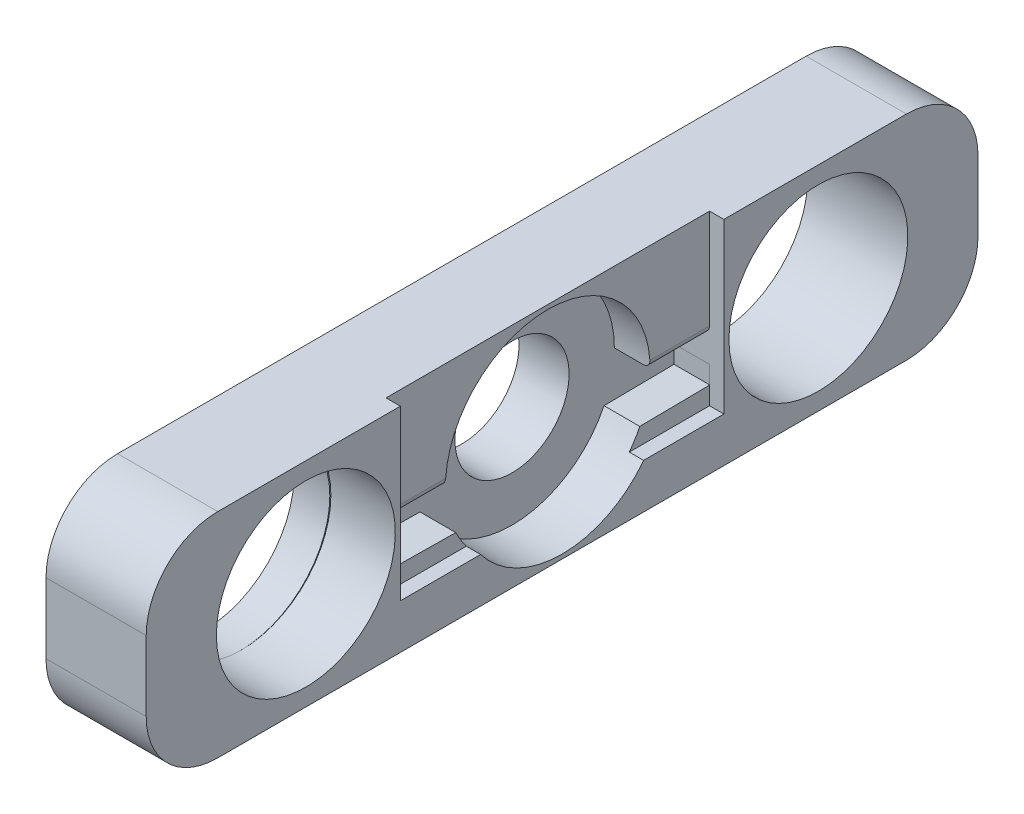
ISO-10303-21;
HEADER;
FILE_DESCRIPTION(('STEP AP214'),'2;1');
FILE_NAME('part.step','',(''),(''),'','','');
FILE_SCHEMA(('AUTOMOTIVE_DESIGN { 1 0 10303 214 1 1 1 1 }'));
ENDSEC;
DATA;
#1=APPLICATION_CONTEXT('core data for automotive mechanical design processes');
#2=APPLICATION_PROTOCOL_DEFINITION('international standard','automotive_design',2000,#1);
#3=PRODUCT_CONTEXT('',#1,'mechanical');
#4=PRODUCT('Part','Part','',(#3));
#5=PRODUCT_RELATED_PRODUCT_CATEGORY('part','',(#4));
#6=PRODUCT_DEFINITION_FORMATION('','',#4);
#7=PRODUCT_DEFINITION_CONTEXT('part definition',#1,'design');
#8=PRODUCT_DEFINITION('design','',#6,#7);
#9=PRODUCT_DEFINITION_SHAPE('','',#8);
#10=(LENGTH_UNIT() NAMED_UNIT(*) SI_UNIT(.MILLI.,.METRE.));
#11=(NAMED_UNIT(*) PLANE_ANGLE_UNIT() SI_UNIT($,.RADIAN.));
#12=(NAMED_UNIT(*) SI_UNIT($,.STERADIAN.) SOLID_ANGLE_UNIT());
#13=UNCERTAINTY_MEASURE_WITH_UNIT(LENGTH_MEASURE(1.E-05),#10,'distance_accuracy_value','');
#14=(GEOMETRIC_REPRESENTATION_CONTEXT(3) GLOBAL_UNCERTAINTY_ASSIGNED_CONTEXT((#13)) GLOBAL_UNIT_ASSIGNED_CONTEXT((#10,
#11,#12)) REPRESENTATION_CONTEXT('',''));
#15=CARTESIAN_POINT('',(0.,0.,0.));
#16=DIRECTION('',(0.,0.,1.));
#17=DIRECTION('',(1.,0.,0.));
#18=AXIS2_PLACEMENT_3D('',#15,#16,#17);
#19=CARTESIAN_POINT('',(-11.,1.,14.3));
#20=DIRECTION('',(0.,0.,-1.));
#21=DIRECTION('',(-1.,0.,0.));
#22=AXIS2_PLACEMENT_3D('',#19,#20,#21);
#23=CYLINDRICAL_SURFACE('',#22,1.);
#24=DIRECTION('',(0.,0.,1.));
#25=VECTOR('',#24,1.);
#26=CARTESIAN_POINT('',(-11.,0.,14.3));
#27=LINE('',#26,#25);
#28=CARTESIAN_POINT('',(-11.,0.,14.3));
#29=VERTEX_POINT('',#28);
#30=CARTESIAN_POINT('',(-11.,0.,22.6));
#31=VERTEX_POINT('',#30);
#32=EDGE_CURVE('E505',#29,#31,#27,.T.);
#33=ORIENTED_EDGE('',*,*,#32,.F.);
#34=CARTESIAN_POINT('',(-10.,1.,14.2649921135625));
#35=CARTESIAN_POINT('',(-10.0000001839213,0.971940749647382,14.2669595760492));
#36=CARTESIAN_POINT('',(-10.0011817400867,0.943888854816139,14.2688422971478));
#37=CARTESIAN_POINT('',(-10.0058983819772,0.887973225385914,14.2724309981915));
#38=CARTESIAN_POINT('',(-10.0094333924086,0.860109484796131,14.2741369837888));
#39=CARTESIAN_POINT('',(-10.0235396717351,0.7771474965545,14.278973910728));
#40=CARTESIAN_POINT('',(-10.037612260885,0.722586611283484,14.2818302315195));
#41=CARTESIAN_POINT('',(-10.0747227897028,0.616564658218299,14.2868007102646));
#42=CARTESIAN_POINT('',(-10.097765728254,0.565105337322298,14.2889144531519));
#43=CARTESIAN_POINT('',(-10.1521684449225,0.466767810094607,14.2924647617664));
#44=CARTESIAN_POINT('',(-10.1835265504415,0.419888685047451,14.2939014635194));
#45=CARTESIAN_POINT('',(-10.2536269156193,0.332108624927635,14.2962104641583));
#46=CARTESIAN_POINT('',(-10.2923596003502,0.29120005820936,14.2970834885217));
#47=CARTESIAN_POINT('',(-10.3761482015788,0.216443239679163,14.2984108818175));
#48=CARTESIAN_POINT('',(-10.4212054139915,0.182596438387455,14.2988651648039));
#49=CARTESIAN_POINT('',(-10.5163888142007,0.122914263973113,14.2995030266934));
#50=CARTESIAN_POINT('',(-10.5665187818761,0.0970849240898362,14.2996864021234));
#51=CARTESIAN_POINT('',(-10.670391751839,0.0542143238037651,14.2999133955513));
#52=CARTESIAN_POINT('',(-10.7241326612563,0.0371680216555287,14.2999570938034));
#53=CARTESIAN_POINT('',(-10.8151609301139,0.0165262477101793,14.2999928119395));
#54=CARTESIAN_POINT('',(-10.8518803391918,0.0103328404690452,14.2999972953188));
#55=CARTESIAN_POINT('',(-10.9257280673413,0.00207012374308491,14.3000000171854));
#56=CARTESIAN_POINT('',(-10.9628557418425,-4.94835473675728E-06,14.2999982644082));
#57=CARTESIAN_POINT('',(-11.,0.,14.3));
#58=B_SPLINE_CURVE_WITH_KNOTS('',3,(#34,#35,#36,#37,#38,#39,#40,#41,#42,#43,#44,#45,#46,#47,#48,
#49,#50,#51,#52,#53,#54,#55,#56,#57),.UNSPECIFIED.,.F.,.F.,(4,2,2,2,2,2,2,2,2,2,2,4),(0.,
0.0843330220050772,0.168663346078217,0.337051221440211,0.50553306851618,0.673981051093867,
0.842211799270698,1.0104770688976,1.17886865496707,1.34716347087021,1.4586621996317,
1.57000480260976),.UNSPECIFIED.);
#59=CARTESIAN_POINT('',(-10.,1.,14.2649921135625));
#60=VERTEX_POINT('',#59);
#61=EDGE_CURVE('E47',#60,#29,#58,.T.);
#62=ORIENTED_EDGE('',*,*,#61,.F.);
#63=DIRECTION('',(0.,0.,1.));
#64=VECTOR('',#63,1.);
#65=CARTESIAN_POINT('',(-10.,1.,14.3));
#66=LINE('',#65,#64);
#67=CARTESIAN_POINT('',(-10.,1.,22.6));
#68=VERTEX_POINT('',#67);
#69=EDGE_CURVE('E504',#68,#60,#66,.F.);
#70=ORIENTED_EDGE('',*,*,#69,.F.);
#71=CARTESIAN_POINT('',(-11.,1.,22.6));
#72=DIRECTION('',(0.,0.,1.));
#73=DIRECTION('',(0.,-1.,0.));
#74=AXIS2_PLACEMENT_3D('',#71,#72,#73);
#75=CIRCLE('',#74,1.);
#76=EDGE_CURVE('E11',#68,#31,#75,.F.);
#77=ORIENTED_EDGE('',*,*,#76,.T.);
#78=EDGE_LOOP('',(#33,#62,#70,#77));
#79=FACE_BOUND('',#78,.T.);
#80=ADVANCED_FACE('F41',(#79),#23,.T.);
#81=CARTESIAN_POINT('',(-11.,1.,-14.3));
#82=DIRECTION('',(0.,0.,1.));
#83=DIRECTION('',(1.,0.,0.));
#84=AXIS2_PLACEMENT_3D('',#81,#82,#83);
#85=CYLINDRICAL_SURFACE('',#84,1.);
#86=DIRECTION('',(0.,0.,1.));
#87=VECTOR('',#86,1.);
#88=CARTESIAN_POINT('',(-11.,0.,-14.3));
#89=LINE('',#88,#87);
#90=CARTESIAN_POINT('',(-11.,0.,-22.6));
#91=VERTEX_POINT('',#90);
#92=CARTESIAN_POINT('',(-11.,0.,-14.3));
#93=VERTEX_POINT('',#92);
#94=EDGE_CURVE('E432',#91,#93,#89,.T.);
#95=ORIENTED_EDGE('',*,*,#94,.F.);
#96=CARTESIAN_POINT('',(-11.,1.,-22.6));
#97=DIRECTION('',(0.,0.,-1.));
#98=DIRECTION('',(-1.,0.,0.));
#99=AXIS2_PLACEMENT_3D('',#96,#97,#98);
#100=CIRCLE('',#99,1.);
#101=CARTESIAN_POINT('',(-10.,1.,-22.6));
#102=VERTEX_POINT('',#101);
#103=EDGE_CURVE('E507',#91,#102,#100,.F.);
#104=ORIENTED_EDGE('',*,*,#103,.T.);
#105=DIRECTION('',(0.,0.,1.));
#106=VECTOR('',#105,1.);
#107=CARTESIAN_POINT('',(-10.,1.,0.));
#108=LINE('',#107,#106);
#109=CARTESIAN_POINT('',(-10.,1.,-14.2649921135625));
#110=VERTEX_POINT('',#109);
#111=EDGE_CURVE('E445',#110,#102,#108,.F.);
#112=ORIENTED_EDGE('',*,*,#111,.F.);
#113=CARTESIAN_POINT('',(-11.,0.,-14.3));
#114=CARTESIAN_POINT('',(-10.9718659509902,1.85908492656748E-07,-14.2999995217285));
#115=CARTESIAN_POINT('',(-10.9437453793993,0.00118803132069571,-14.3000000537811));
#116=CARTESIAN_POINT('',(-10.8877054493952,0.00592682978960824,-14.2999990612576));
#117=CARTESIAN_POINT('',(-10.8597860814195,0.0094776697827219,-14.2999975367799));
#118=CARTESIAN_POINT('',(-10.7766806829,0.0236405886712454,-14.2999837790828));
#119=CARTESIAN_POINT('',(-10.7220512582806,0.037763162510521,-14.2999623874652));
#120=CARTESIAN_POINT('',(-10.6159403542585,0.0749782701949753,-14.2998153977794));
#121=CARTESIAN_POINT('',(-10.5644603879468,0.0980750769548734,-14.2996897500394));
#122=CARTESIAN_POINT('',(-10.4661075809962,0.152581749839348,-14.2992118235167));
#123=CARTESIAN_POINT('',(-10.4192342069557,0.183990651939857,-14.2988595710085));
#124=CARTESIAN_POINT('',(-10.331435971869,0.254223511968777,-14.297783035209));
#125=CARTESIAN_POINT('',(-10.2905102433464,0.293046386638525,-14.2970588062412));
#126=CARTESIAN_POINT('',(-10.2157602627699,0.377001659678559,-14.2950910887215));
#127=CARTESIAN_POINT('',(-10.1819358609677,0.422133924966905,-14.2938476111209));
#128=CARTESIAN_POINT('',(-10.122375258321,0.517375988508842,-14.2907167747901));
#129=CARTESIAN_POINT('',(-10.0966316284675,0.567481158832635,-14.2888300108109));
#130=CARTESIAN_POINT('',(-10.0539093320197,0.671269038674405,-14.284330436707));
#131=CARTESIAN_POINT('',(-10.0369319800324,0.724952283404817,-14.2817175177772));
#132=CARTESIAN_POINT('',(-10.0122232801207,0.834360971890957,-14.275742841679));
#133=CARTESIAN_POINT('',(-10.0044866050497,0.890085219914423,-14.2723815172854));
#134=CARTESIAN_POINT('',(-9.99994394154403,0.973982347737459,-14.2668199685369));
#135=CARTESIAN_POINT('',(-9.99960936293525,1.00202256437248,-14.2648777506571));
#136=CARTESIAN_POINT('',(-10.0012921662766,1.05802161976243,-14.2608337735012));
#137=CARTESIAN_POINT('',(-10.0033096102977,1.08598045635018,-14.2587320100158));
#138=CARTESIAN_POINT('',(-10.0064977822243,1.11381275532523,-14.2565571280753));
#139=B_SPLINE_CURVE_WITH_KNOTS('',3,(#113,#114,#115,#116,#117,#118,#119,#120,#121,#122,#123,
#124,#125,#126,#127,#128,#129,#130,#131,#132,#133,#134,#135,#136,#137,#138),.UNSPECIFIED.,.F.,
.F.,(4,2,2,2,2,2,2,2,2,2,2,2,4),(0.,0.0843503080913396,0.168696580513882,0.337104496051248,
0.505592694350302,0.674061360203864,0.842505429836438,1.01094594706855,1.17923115288472,
1.34754158773194,1.51575494659624,1.59999746708655,1.68424221082298),.UNSPECIFIED.);
#140=EDGE_CURVE('E431',#93,#110,#139,.T.);
#141=ORIENTED_EDGE('',*,*,#140,.F.);
#142=EDGE_LOOP('',(#95,#104,#112,#141));
#143=FACE_BOUND('',#142,.T.);
#144=ADVANCED_FACE('F449',(#143),#85,.T.);
#145=CARTESIAN_POINT('',(-17.,0.,0.));
#146=DIRECTION('',(-1.,0.,0.));
#147=DIRECTION('',(0.,0.,1.));
#148=AXIS2_PLACEMENT_3D('',#145,#146,#147);
#149=PLANE('',#148);
#150=CARTESIAN_POINT('',(-17.,0.,35.8));
#151=DIRECTION('',(1.,0.,0.));
#152=DIRECTION('',(0.,0.,-1.));
#153=AXIS2_PLACEMENT_3D('',#150,#151,#152);
#154=CIRCLE('',#153,12.5);
#155=CARTESIAN_POINT('',(-17.,12.499774997975,35.875));
#156=VERTEX_POINT('',#155);
#157=CARTESIAN_POINT('',(-17.,-12.499774997975,35.875));
#158=VERTEX_POINT('',#157);
#159=EDGE_CURVE('E408',#156,#158,#154,.T.);
#160=ORIENTED_EDGE('',*,*,#159,.T.);
#161=CARTESIAN_POINT('',(-17.,0.,35.95));
#162=DIRECTION('',(-1.,0.,0.));
#163=DIRECTION('',(0.,0.,1.));
#164=AXIS2_PLACEMENT_3D('',#161,#162,#163);
#165=CIRCLE('',#164,12.5);
#166=EDGE_CURVE('E427',#158,#156,#165,.T.);
#167=ORIENTED_EDGE('',*,*,#166,.T.);
#168=EDGE_LOOP('',(#160,#167));
#169=FACE_BOUND('',#168,.T.);
#170=ADVANCED_FACE('F455',(#169),#149,.T.);
#171=CARTESIAN_POINT('',(-10.,0.,0.));
#172=DIRECTION('',(-1.,0.,0.));
#173=DIRECTION('',(0.,0.,1.));
#174=AXIS2_PLACEMENT_3D('',#171,#172,#173);
#175=PLANE('',#174);
#176=DIRECTION('',(0.,-1.,0.));
#177=VECTOR('',#176,1.);
#178=CARTESIAN_POINT('',(-10.,14.9000000000115,22.6));
#179=LINE('',#178,#177);
#180=CARTESIAN_POINT('',(-10.,14.9000000000115,22.6));
#181=VERTEX_POINT('',#180);
#182=EDGE_CURVE('E350',#181,#68,#179,.T.);
#183=ORIENTED_EDGE('',*,*,#182,.T.);
#184=ORIENTED_EDGE('',*,*,#69,.T.);
#185=CARTESIAN_POINT('',(-10.,0.,0.));
#186=DIRECTION('',(-1.,0.,0.));
#187=DIRECTION('',(0.,0.,1.));
#188=AXIS2_PLACEMENT_3D('',#185,#186,#187);
#189=CIRCLE('',#188,14.3);
#190=EDGE_CURVE('E428',#60,#110,#189,.T.);
#191=ORIENTED_EDGE('',*,*,#190,.T.);
#192=ORIENTED_EDGE('',*,*,#111,.T.);
#193=DIRECTION('',(0.,1.,0.));
#194=VECTOR('',#193,1.);
#195=CARTESIAN_POINT('',(-10.,14.9000000000115,-22.6));
#196=LINE('',#195,#194);
#197=CARTESIAN_POINT('',(-10.,14.9000000000115,-22.6));
#198=VERTEX_POINT('',#197);
#199=EDGE_CURVE('E336',#102,#198,#196,.T.);
#200=ORIENTED_EDGE('',*,*,#199,.T.);
#201=DIRECTION('',(0.,0.,1.));
#202=VECTOR('',#201,1.);
#203=CARTESIAN_POINT('',(-10.,14.9000000000115,-22.6));
#204=LINE('',#203,#202);
#205=EDGE_CURVE('E343',#198,#181,#204,.T.);
#206=ORIENTED_EDGE('',*,*,#205,.T.);
#207=EDGE_LOOP('',(#183,#184,#191,#192,#200,#206));
#208=FACE_BOUND('',#207,.T.);
#209=ADVANCED_FACE('F482',(#208),#175,.F.);
#210=CARTESIAN_POINT('',(-15.,0.,0.));
#211=DIRECTION('',(1.,0.,0.));
#212=DIRECTION('',(0.,0.,-1.));
#213=AXIS2_PLACEMENT_3D('',#210,#211,#212);
#214=CYLINDRICAL_SURFACE('',#213,14.3);
#215=CARTESIAN_POINT('',(-15.,0.,0.));
#216=DIRECTION('',(-1.,0.,0.));
#217=DIRECTION('',(0.,0.,1.));
#218=AXIS2_PLACEMENT_3D('',#215,#216,#217);
#219=CIRCLE('',#218,14.3);
#220=CARTESIAN_POINT('',(-15.,-6.26975974502702,-12.8522415453351));
#221=VERTEX_POINT('',#220);
#222=CARTESIAN_POINT('',(-15.,-6.26975974502702,12.8522415453351));
#223=VERTEX_POINT('',#222);
#224=EDGE_CURVE('E405',#221,#223,#219,.T.);
#225=ORIENTED_EDGE('',*,*,#224,.T.);
#226=DIRECTION('',(1.,0.,0.));
#227=VECTOR('',#226,1.);
#228=CARTESIAN_POINT('',(-15.,-6.26975974502702,12.8522415453351));
#229=LINE('',#228,#227);
#230=CARTESIAN_POINT('',(-10.,-6.26975974502702,12.8522415453351));
#231=VERTEX_POINT('',#230);
#232=EDGE_CURVE('E293',#223,#231,#229,.T.);
#233=ORIENTED_EDGE('',*,*,#232,.T.);
#234=CARTESIAN_POINT('',(-10.,-8.64999999998854,11.3871638260015));
#235=VERTEX_POINT('',#234);
#236=EDGE_CURVE('E424',#235,#231,#189,.T.);
#237=ORIENTED_EDGE('',*,*,#236,.F.);
#238=DIRECTION('',(1.,0.,0.));
#239=VECTOR('',#238,1.);
#240=CARTESIAN_POINT('',(-15.,-8.64999999998854,11.3871638260015));
#241=LINE('',#240,#239);
#242=CARTESIAN_POINT('',(-8.00000000000003,-8.64999999998854,11.3871638260016));
#243=VERTEX_POINT('',#242);
#244=EDGE_CURVE('E362',#243,#235,#241,.F.);
#245=ORIENTED_EDGE('',*,*,#244,.F.);
#246=CARTESIAN_POINT('',(-8.00000000000003,0.,0.));
#247=DIRECTION('',(-1.,0.,0.));
#248=DIRECTION('',(0.,0.,1.));
#249=AXIS2_PLACEMENT_3D('',#246,#247,#248);
#250=CIRCLE('',#249,14.3);
#251=CARTESIAN_POINT('',(-8.00000000000003,-8.64999999998854,-11.3871638260015));
#252=VERTEX_POINT('',#251);
#253=EDGE_CURVE('E371',#252,#243,#250,.T.);
#254=ORIENTED_EDGE('',*,*,#253,.F.);
#255=DIRECTION('',(1.,0.,0.));
#256=VECTOR('',#255,1.);
#257=CARTESIAN_POINT('',(-15.,-8.64999999998854,-11.3871638260016));
#258=LINE('',#257,#256);
#259=CARTESIAN_POINT('',(-10.,-8.64999999998854,-11.3871638260016));
#260=VERTEX_POINT('',#259);
#261=EDGE_CURVE('E372',#260,#252,#258,.T.);
#262=ORIENTED_EDGE('',*,*,#261,.F.);
#263=CARTESIAN_POINT('',(-10.,-6.26975974502702,-12.8522415453351));
#264=VERTEX_POINT('',#263);
#265=EDGE_CURVE('E429',#264,#260,#189,.T.);
#266=ORIENTED_EDGE('',*,*,#265,.F.);
#267=DIRECTION('',(1.,0.,0.));
#268=VECTOR('',#267,1.);
#269=CARTESIAN_POINT('',(-15.,-6.26975974502702,-12.8522415453351));
#270=LINE('',#269,#268);
#271=EDGE_CURVE('E320',#221,#264,#270,.T.);
#272=ORIENTED_EDGE('',*,*,#271,.F.);
#273=EDGE_LOOP('',(#225,#233,#237,#245,#254,#262,#266,#272));
#274=FACE_BOUND('',#273,.T.);
#275=ADVANCED_FACE('F561',(#274),#214,.F.);
#276=ORIENTED_EDGE('',*,*,#236,.T.);
#277=DIRECTION('',(0.,0.0122849481946987,0.999924537176608));
#278=VECTOR('',#277,1.);
#279=CARTESIAN_POINT('',(-10.,-6.26975974502702,12.8522415453351));
#280=LINE('',#279,#278);
#281=CARTESIAN_POINT('',(-10.,-6.14999999998854,22.6));
#282=VERTEX_POINT('',#281);
#283=EDGE_CURVE('E278',#231,#282,#280,.T.);
#284=ORIENTED_EDGE('',*,*,#283,.T.);
#285=CARTESIAN_POINT('',(-10.,-8.64999999998854,22.6));
#286=VERTEX_POINT('',#285);
#287=EDGE_CURVE('E346',#282,#286,#179,.T.);
#288=ORIENTED_EDGE('',*,*,#287,.T.);
#289=DIRECTION('',(0.,0.,-1.));
#290=VECTOR('',#289,1.);
#291=CARTESIAN_POINT('',(-10.,-8.64999999998854,22.6));
#292=LINE('',#291,#290);
#293=EDGE_CURVE('E338',#286,#235,#292,.T.);
#294=ORIENTED_EDGE('',*,*,#293,.T.);
#295=EDGE_LOOP('',(#276,#284,#288,#294));
#296=FACE_BOUND('',#295,.T.);
#297=ADVANCED_FACE('F549',(#296),#175,.F.);
#298=DIRECTION('',(0.,0.0122849481946987,-0.999924537176608));
#299=VECTOR('',#298,1.);
#300=CARTESIAN_POINT('',(-10.,-6.26975974502702,-12.8522415453351));
#301=LINE('',#300,#299);
#302=CARTESIAN_POINT('',(-10.,-6.14999999998854,-22.6));
#303=VERTEX_POINT('',#302);
#304=EDGE_CURVE('E316',#264,#303,#301,.T.);
#305=ORIENTED_EDGE('',*,*,#304,.F.);
#306=ORIENTED_EDGE('',*,*,#265,.T.);
#307=CARTESIAN_POINT('',(-10.,-8.64999999998854,-22.6));
#308=VERTEX_POINT('',#307);
#309=EDGE_CURVE('E339',#260,#308,#292,.T.);
#310=ORIENTED_EDGE('',*,*,#309,.T.);
#311=EDGE_CURVE('E337',#308,#303,#196,.T.);
#312=ORIENTED_EDGE('',*,*,#311,.T.);
#313=EDGE_LOOP('',(#305,#306,#310,#312));
#314=FACE_BOUND('',#313,.T.);
#315=ADVANCED_FACE('F571',(#314),#175,.F.);
#316=ORIENTED_EDGE('',*,*,#190,.F.);
#317=ORIENTED_EDGE('',*,*,#61,.T.);
#318=DIRECTION('',(1.,0.,0.));
#319=VECTOR('',#318,1.);
#320=CARTESIAN_POINT('',(-15.,0.,14.3));
#321=LINE('',#320,#319);
#322=CARTESIAN_POINT('',(-15.,0.,14.3));
#323=VERTEX_POINT('',#322);
#324=EDGE_CURVE('E283',#323,#29,#321,.T.);
#325=ORIENTED_EDGE('',*,*,#324,.F.);
#326=CARTESIAN_POINT('',(-15.,0.,-14.3));
#327=VERTEX_POINT('',#326);
#328=EDGE_CURVE('E402',#323,#327,#219,.T.);
#329=ORIENTED_EDGE('',*,*,#328,.T.);
#330=DIRECTION('',(1.,0.,0.));
#331=VECTOR('',#330,1.);
#332=CARTESIAN_POINT('',(-15.,0.,-14.3));
#333=LINE('',#332,#331);
#334=EDGE_CURVE('E325',#327,#93,#333,.T.);
#335=ORIENTED_EDGE('',*,*,#334,.T.);
#336=ORIENTED_EDGE('',*,*,#140,.T.);
#337=EDGE_LOOP('',(#316,#317,#325,#329,#335,#336));
#338=FACE_BOUND('',#337,.T.);
#339=ADVANCED_FACE('F444',(#338),#214,.F.);
#340=CARTESIAN_POINT('',(-17.,14.9000000000115,116758.401593134));
#341=DIRECTION('',(0.,1.,0.));
#342=DIRECTION('',(0.,0.,1.));
#343=AXIS2_PLACEMENT_3D('',#340,#341,#342);
#344=PLANE('',#343);
#345=ORIENTED_EDGE('',*,*,#205,.F.);
#346=DIRECTION('',(1.,0.,0.));
#347=VECTOR('',#346,1.);
#348=CARTESIAN_POINT('',(-10.,14.9000000000115,-22.6));
#349=LINE('',#348,#347);
#350=CARTESIAN_POINT('',(-8.00000000000003,14.9000000000115,-22.6));
#351=VERTEX_POINT('',#350);
#352=EDGE_CURVE('E361',#198,#351,#349,.T.);
#353=ORIENTED_EDGE('',*,*,#352,.T.);
#354=DIRECTION('',(0.,0.,1.));
#355=VECTOR('',#354,1.);
#356=CARTESIAN_POINT('',(-8.00000000000003,14.9000000000115,116758.401593134));
#357=LINE('',#356,#355);
#358=CARTESIAN_POINT('',(-8.00000000000003,14.9000000000206,-48.1000000000051));
#359=VERTEX_POINT('',#358);
#360=EDGE_CURVE('E383',#359,#351,#357,.T.);
#361=ORIENTED_EDGE('',*,*,#360,.F.);
#362=DIRECTION('',(1.,0.,0.));
#363=VECTOR('',#362,1.);
#364=CARTESIAN_POINT('',(-17.,14.9000000000115,-48.099999999996));
#365=LINE('',#364,#363);
#366=CARTESIAN_POINT('',(-22.,14.9000000000115,-48.099999999996));
#367=VERTEX_POINT('',#366);
#368=EDGE_CURVE('E241',#359,#367,#365,.F.);
#369=ORIENTED_EDGE('',*,*,#368,.T.);
#370=DIRECTION('',(0.,0.,-1.));
#371=VECTOR('',#370,1.);
#372=CARTESIAN_POINT('',(-22.,14.9000000000115,-48.099999999996));
#373=LINE('',#372,#371);
#374=CARTESIAN_POINT('',(-22.,14.9000000000115,48.099999999996));
#375=VERTEX_POINT('',#374);
#376=EDGE_CURVE('E239',#375,#367,#373,.T.);
#377=ORIENTED_EDGE('',*,*,#376,.F.);
#378=DIRECTION('',(-1.,0.,0.));
#379=VECTOR('',#378,1.);
#380=CARTESIAN_POINT('',(-17.,14.9000000000115,48.0999999999909));
#381=LINE('',#380,#379);
#382=CARTESIAN_POINT('',(-8.00000000000003,14.9000000000115,48.1000000000051));
#383=VERTEX_POINT('',#382);
#384=EDGE_CURVE('E223',#375,#383,#381,.F.);
#385=ORIENTED_EDGE('',*,*,#384,.T.);
#386=CARTESIAN_POINT('',(-8.00000000000003,14.9000000000115,22.6));
#387=VERTEX_POINT('',#386);
#388=EDGE_CURVE('E384',#387,#383,#357,.T.);
#389=ORIENTED_EDGE('',*,*,#388,.F.);
#390=DIRECTION('',(1.,0.,0.));
#391=VECTOR('',#390,1.);
#392=CARTESIAN_POINT('',(-10.,14.9000000000115,22.6));
#393=LINE('',#392,#391);
#394=EDGE_CURVE('E365',#181,#387,#393,.T.);
#395=ORIENTED_EDGE('',*,*,#394,.F.);
#396=EDGE_LOOP('',(#345,#353,#361,#369,#377,#385,#389,#395));
#397=FACE_BOUND('',#396,.T.);
#398=ADVANCED_FACE('F238',(#397),#344,.T.);
#399=CARTESIAN_POINT('',(-8.00000000000003,0.,0.));
#400=DIRECTION('',(-1.,0.,0.));
#401=DIRECTION('',(0.,0.,1.));
#402=AXIS2_PLACEMENT_3D('',#399,#400,#401);
#403=PLANE('',#402);
#404=CARTESIAN_POINT('',(-8.00000000000003,0.,35.8));
#405=DIRECTION('',(-1.,0.,0.));
#406=DIRECTION('',(0.,0.,1.));
#407=AXIS2_PLACEMENT_3D('',#404,#405,#406);
#408=CIRCLE('',#407,12.5);
#409=CARTESIAN_POINT('',(-8.00000000000003,0.,48.3));
#410=VERTEX_POINT('',#409);
#411=EDGE_CURVE('E392',#410,#410,#408,.F.);
#412=ORIENTED_EDGE('',*,*,#411,.F.);
#413=EDGE_LOOP('',(#412));
#414=FACE_BOUND('',#413,.T.);
#415=CARTESIAN_POINT('',(-8.00000000000003,0.,-35.8));
#416=DIRECTION('',(-1.,0.,0.));
#417=DIRECTION('',(0.,0.,1.));
#418=AXIS2_PLACEMENT_3D('',#415,#416,#417);
#419=CIRCLE('',#418,12.5);
#420=CARTESIAN_POINT('',(-8.00000000000003,0.,-23.3));
#421=VERTEX_POINT('',#420);
#422=EDGE_CURVE('E374',#421,#421,#419,.T.);
#423=ORIENTED_EDGE('',*,*,#422,.T.);
#424=EDGE_LOOP('',(#423));
#425=FACE_BOUND('',#424,.T.);
#426=DIRECTION('',(0.,0.,-1.));
#427=VECTOR('',#426,1.);
#428=CARTESIAN_POINT('',(-8.00000000000003,-8.64999999998854,22.6));
#429=LINE('',#428,#427);
#430=CARTESIAN_POINT('',(-8.00000000000003,-8.64999999998854,-22.6));
#431=VERTEX_POINT('',#430);
#432=EDGE_CURVE('E353',#252,#431,#429,.T.);
#433=ORIENTED_EDGE('',*,*,#432,.F.);
#434=ORIENTED_EDGE('',*,*,#253,.T.);
#435=CARTESIAN_POINT('',(-8.00000000000003,-8.64999999998854,22.6));
#436=VERTEX_POINT('',#435);
#437=EDGE_CURVE('E323',#436,#243,#429,.T.);
#438=ORIENTED_EDGE('',*,*,#437,.F.);
#439=DIRECTION('',(0.,-1.,0.));
#440=VECTOR('',#439,1.);
#441=CARTESIAN_POINT('',(-8.00000000000003,14.9000000000115,22.6));
#442=LINE('',#441,#440);
#443=EDGE_CURVE('E357',#387,#436,#442,.T.);
#444=ORIENTED_EDGE('',*,*,#443,.F.);
#445=ORIENTED_EDGE('',*,*,#388,.T.);
#446=CARTESIAN_POINT('',(-8.00000000000003,4.90000000002055,48.099999999996));
#447=DIRECTION('',(-1.,0.,0.));
#448=DIRECTION('',(0.,0.,1.));
#449=AXIS2_PLACEMENT_3D('',#446,#447,#448);
#450=CIRCLE('',#449,10.);
#451=CARTESIAN_POINT('',(-8.00000000000003,4.90000000002055,58.099999999996));
#452=VERTEX_POINT('',#451);
#453=EDGE_CURVE('E232',#383,#452,#450,.F.);
#454=ORIENTED_EDGE('',*,*,#453,.T.);
#455=DIRECTION('',(0.,-1.,0.));
#456=VECTOR('',#455,1.);
#457=CARTESIAN_POINT('',(-8.00000000000003,-481034.717744328,58.099999999996));
#458=LINE('',#457,#456);
#459=CARTESIAN_POINT('',(-8.00000000000003,-4.90000000002055,58.099999999996));
#460=VERTEX_POINT('',#459);
#461=EDGE_CURVE('E391',#452,#460,#458,.T.);
#462=ORIENTED_EDGE('',*,*,#461,.T.);
#463=CARTESIAN_POINT('',(-8.00000000000003,-4.90000000002055,48.099999999996));
#464=DIRECTION('',(-1.,0.,0.));
#465=DIRECTION('',(0.,0.,1.));
#466=AXIS2_PLACEMENT_3D('',#463,#464,#465);
#467=CIRCLE('',#466,10.);
#468=CARTESIAN_POINT('',(-8.00000000000003,-14.9000000000115,48.1000000000051));
#469=VERTEX_POINT('',#468);
#470=EDGE_CURVE('E393',#460,#469,#467,.F.);
#471=ORIENTED_EDGE('',*,*,#470,.T.);
#472=DIRECTION('',(0.,0.,-1.));
#473=VECTOR('',#472,1.);
#474=CARTESIAN_POINT('',(-8.00000000000003,-14.9000000000115,116758.401593134));
#475=LINE('',#474,#473);
#476=CARTESIAN_POINT('',(-8.00000000000003,-14.9000000000206,-48.1000000000051));
#477=VERTEX_POINT('',#476);
#478=EDGE_CURVE('E389',#469,#477,#475,.T.);
#479=ORIENTED_EDGE('',*,*,#478,.T.);
#480=CARTESIAN_POINT('',(-8.00000000000003,-4.90000000002055,-48.099999999996));
#481=DIRECTION('',(-1.,0.,0.));
#482=DIRECTION('',(0.,0.,1.));
#483=AXIS2_PLACEMENT_3D('',#480,#481,#482);
#484=CIRCLE('',#483,10.);
#485=CARTESIAN_POINT('',(-8.00000000000003,-4.90000000002055,-58.099999999996));
#486=VERTEX_POINT('',#485);
#487=EDGE_CURVE('E385',#477,#486,#484,.F.);
#488=ORIENTED_EDGE('',*,*,#487,.T.);
#489=DIRECTION('',(0.,-1.,0.));
#490=VECTOR('',#489,1.);
#491=CARTESIAN_POINT('',(-8.00000000000003,-481034.717744328,-58.099999999996));
#492=LINE('',#491,#490);
#493=CARTESIAN_POINT('',(-8.00000000000003,4.90000000002055,-58.099999999996));
#494=VERTEX_POINT('',#493);
#495=EDGE_CURVE('E380',#494,#486,#492,.T.);
#496=ORIENTED_EDGE('',*,*,#495,.F.);
#497=CARTESIAN_POINT('',(-8.00000000000003,4.90000000002055,-48.099999999996));
#498=DIRECTION('',(-1.,0.,0.));
#499=DIRECTION('',(0.,0.,1.));
#500=AXIS2_PLACEMENT_3D('',#497,#498,#499);
#501=CIRCLE('',#500,10.);
#502=EDGE_CURVE('E376',#494,#359,#501,.F.);
#503=ORIENTED_EDGE('',*,*,#502,.T.);
#504=ORIENTED_EDGE('',*,*,#360,.T.);
#505=DIRECTION('',(0.,1.,0.));
#506=VECTOR('',#505,1.);
#507=CARTESIAN_POINT('',(-8.00000000000003,14.9000000000115,-22.6));
#508=LINE('',#507,#506);
#509=EDGE_CURVE('E352',#431,#351,#508,.T.);
#510=ORIENTED_EDGE('',*,*,#509,.F.);
#511=EDGE_LOOP('',(#433,#434,#438,#444,#445,#454,#462,#471,#479,#488,#496,#503,#504,#510));
#512=FACE_BOUND('',#511,.T.);
#513=ADVANCED_FACE('F456',(#414,#425,#512),#403,.F.);
#514=CARTESIAN_POINT('',(-17.,-4.90000000002055,-48.099999999996));
#515=DIRECTION('',(1.,0.,0.));
#516=DIRECTION('',(0.,0.,-1.));
#517=AXIS2_PLACEMENT_3D('',#514,#515,#516);
#518=CYLINDRICAL_SURFACE('',#517,10.);
#519=ORIENTED_EDGE('',*,*,#487,.F.);
#520=DIRECTION('',(-1.,0.,0.));
#521=VECTOR('',#520,1.);
#522=CARTESIAN_POINT('',(-17.,-14.9000000000115,-48.099999999996));
#523=LINE('',#522,#521);
#524=CARTESIAN_POINT('',(-22.,-14.9000000000115,-48.099999999996));
#525=VERTEX_POINT('',#524);
#526=EDGE_CURVE('E419',#525,#477,#523,.F.);
#527=ORIENTED_EDGE('',*,*,#526,.F.);
#528=CARTESIAN_POINT('',(-22.,-4.90000000001146,-48.0999999999961));
#529=DIRECTION('',(-1.,0.,0.));
#530=DIRECTION('',(0.,0.,1.));
#531=AXIS2_PLACEMENT_3D('',#528,#529,#530);
#532=CIRCLE('',#531,10.);
#533=CARTESIAN_POINT('',(-22.,-4.90000000001139,-58.099999999996));
#534=VERTEX_POINT('',#533);
#535=EDGE_CURVE('E266',#534,#525,#532,.T.);
#536=ORIENTED_EDGE('',*,*,#535,.F.);
#537=DIRECTION('',(-1.,0.,0.));
#538=VECTOR('',#537,1.);
#539=CARTESIAN_POINT('',(-17.,-4.90000000002055,-58.099999999996));
#540=LINE('',#539,#538);
#541=EDGE_CURVE('E418',#486,#534,#540,.T.);
#542=ORIENTED_EDGE('',*,*,#541,.F.);
#543=EDGE_LOOP('',(#519,#527,#536,#542));
#544=FACE_BOUND('',#543,.T.);
#545=ADVANCED_FACE('F454',(#544),#518,.T.);
#546=CARTESIAN_POINT('',(-17.,4.90000000002055,-48.099999999996));
#547=DIRECTION('',(-1.,0.,0.));
#548=DIRECTION('',(0.,0.,1.));
#549=AXIS2_PLACEMENT_3D('',#546,#547,#548);
#550=CYLINDRICAL_SURFACE('',#549,10.);
#551=ORIENTED_EDGE('',*,*,#502,.F.);
#552=DIRECTION('',(1.,0.,0.));
#553=VECTOR('',#552,1.);
#554=CARTESIAN_POINT('',(-17.,4.90000000002055,-58.099999999996));
#555=LINE('',#554,#553);
#556=CARTESIAN_POINT('',(-22.,4.90000000001139,-58.099999999996));
#557=VERTEX_POINT('',#556);
#558=EDGE_CURVE('E414',#557,#494,#555,.T.);
#559=ORIENTED_EDGE('',*,*,#558,.F.);
#560=CARTESIAN_POINT('',(-22.,4.90000000001146,-48.099999999996));
#561=DIRECTION('',(-1.,0.,0.));
#562=DIRECTION('',(0.,0.,-1.));
#563=AXIS2_PLACEMENT_3D('',#560,#561,#562);
#564=CIRCLE('',#563,10.);
#565=EDGE_CURVE('E250',#367,#557,#564,.T.);
#566=ORIENTED_EDGE('',*,*,#565,.F.);
#567=ORIENTED_EDGE('',*,*,#368,.F.);
#568=EDGE_LOOP('',(#551,#559,#566,#567));
#569=FACE_BOUND('',#568,.T.);
#570=ADVANCED_FACE('F460',(#569),#550,.T.);
#571=CARTESIAN_POINT('',(-17.,-4.90000000002055,48.099999999996));
#572=DIRECTION('',(1.,0.,0.));
#573=DIRECTION('',(0.,0.,-1.));
#574=AXIS2_PLACEMENT_3D('',#571,#572,#573);
#575=CYLINDRICAL_SURFACE('',#574,10.);
#576=ORIENTED_EDGE('',*,*,#470,.F.);
#577=DIRECTION('',(1.,0.,0.));
#578=VECTOR('',#577,1.);
#579=CARTESIAN_POINT('',(-17.,-4.90000000002055,58.099999999996));
#580=LINE('',#579,#578);
#581=CARTESIAN_POINT('',(-22.,-4.90000000001146,58.099999999996));
#582=VERTEX_POINT('',#581);
#583=EDGE_CURVE('E234',#582,#460,#580,.T.);
#584=ORIENTED_EDGE('',*,*,#583,.F.);
#585=CARTESIAN_POINT('',(-22.,-4.90000000001146,48.0999999999961));
#586=DIRECTION('',(-1.,0.,0.));
#587=DIRECTION('',(0.,0.,1.));
#588=AXIS2_PLACEMENT_3D('',#585,#586,#587);
#589=CIRCLE('',#588,10.);
#590=CARTESIAN_POINT('',(-22.,-14.9000000000115,48.099999999996));
#591=VERTEX_POINT('',#590);
#592=EDGE_CURVE('E275',#591,#582,#589,.T.);
#593=ORIENTED_EDGE('',*,*,#592,.F.);
#594=DIRECTION('',(1.,0.,0.));
#595=VECTOR('',#594,1.);
#596=CARTESIAN_POINT('',(-17.,-14.9000000000115,48.0999999999909));
#597=LINE('',#596,#595);
#598=EDGE_CURVE('E415',#469,#591,#597,.F.);
#599=ORIENTED_EDGE('',*,*,#598,.F.);
#600=EDGE_LOOP('',(#576,#584,#593,#599));
#601=FACE_BOUND('',#600,.T.);
#602=ADVANCED_FACE('F465',(#601),#575,.T.);
#603=CARTESIAN_POINT('',(-17.,4.90000000002055,48.099999999996));
#604=DIRECTION('',(-1.,0.,0.));
#605=DIRECTION('',(0.,0.,1.));
#606=AXIS2_PLACEMENT_3D('',#603,#604,#605);
#607=CYLINDRICAL_SURFACE('',#606,10.);
#608=ORIENTED_EDGE('',*,*,#453,.F.);
#609=ORIENTED_EDGE('',*,*,#384,.F.);
#610=CARTESIAN_POINT('',(-22.,4.90000000001146,48.099999999996));
#611=DIRECTION('',(-1.,0.,0.));
#612=DIRECTION('',(0.,0.,-1.));
#613=AXIS2_PLACEMENT_3D('',#610,#611,#612);
#614=CIRCLE('',#613,10.);
#615=CARTESIAN_POINT('',(-22.,4.90000000001139,58.099999999996));
#616=VERTEX_POINT('',#615);
#617=EDGE_CURVE('E226',#616,#375,#614,.T.);
#618=ORIENTED_EDGE('',*,*,#617,.F.);
#619=DIRECTION('',(-1.,0.,0.));
#620=VECTOR('',#619,1.);
#621=CARTESIAN_POINT('',(-17.,4.90000000002055,58.099999999996));
#622=LINE('',#621,#620);
#623=EDGE_CURVE('E233',#452,#616,#622,.T.);
#624=ORIENTED_EDGE('',*,*,#623,.F.);
#625=EDGE_LOOP('',(#608,#609,#618,#624));
#626=FACE_BOUND('',#625,.T.);
#627=ADVANCED_FACE('F230',(#626),#607,.T.);
#628=CARTESIAN_POINT('',(-17.,-14.9000000000115,116758.401593134));
#629=DIRECTION('',(0.,-1.,0.));
#630=DIRECTION('',(0.,0.,-1.));
#631=AXIS2_PLACEMENT_3D('',#628,#629,#630);
#632=PLANE('',#631);
#633=ORIENTED_EDGE('',*,*,#478,.F.);
#634=ORIENTED_EDGE('',*,*,#598,.T.);
#635=DIRECTION('',(0.,0.,1.));
#636=VECTOR('',#635,1.);
#637=CARTESIAN_POINT('',(-22.,-14.9000000000115,-48.099999999996));
#638=LINE('',#637,#636);
#639=EDGE_CURVE('E267',#525,#591,#638,.T.);
#640=ORIENTED_EDGE('',*,*,#639,.F.);
#641=ORIENTED_EDGE('',*,*,#526,.T.);
#642=EDGE_LOOP('',(#633,#634,#640,#641));
#643=FACE_BOUND('',#642,.T.);
#644=ADVANCED_FACE('F469',(#643),#632,.T.);
#645=CARTESIAN_POINT('',(-17.,-481034.717744328,58.099999999996));
#646=DIRECTION('',(0.,0.,1.));
#647=DIRECTION('',(1.,0.,0.));
#648=AXIS2_PLACEMENT_3D('',#645,#646,#647);
#649=PLANE('',#648);
#650=ORIENTED_EDGE('',*,*,#461,.F.);
#651=ORIENTED_EDGE('',*,*,#623,.T.);
#652=DIRECTION('',(0.,1.,0.));
#653=VECTOR('',#652,1.);
#654=CARTESIAN_POINT('',(-22.,4.90000000001139,58.099999999996));
#655=LINE('',#654,#653);
#656=EDGE_CURVE('E254',#582,#616,#655,.T.);
#657=ORIENTED_EDGE('',*,*,#656,.F.);
#658=ORIENTED_EDGE('',*,*,#583,.T.);
#659=EDGE_LOOP('',(#650,#651,#657,#658));
#660=FACE_BOUND('',#659,.T.);
#661=ADVANCED_FACE('F475',(#660),#649,.T.);
#662=CARTESIAN_POINT('',(-17.,0.,35.8));
#663=DIRECTION('',(1.,0.,0.));
#664=DIRECTION('',(0.,0.,-1.));
#665=AXIS2_PLACEMENT_3D('',#662,#663,#664);
#666=CYLINDRICAL_SURFACE('',#665,12.5);
#667=ORIENTED_EDGE('',*,*,#411,.T.);
#668=EDGE_LOOP('',(#667));
#669=FACE_BOUND('',#668,.T.);
#670=ORIENTED_EDGE('',*,*,#159,.F.);
#671=EDGE_CURVE('E401',#158,#156,#154,.T.);
#672=ORIENTED_EDGE('',*,*,#671,.F.);
#673=EDGE_LOOP('',(#670,#672));
#674=FACE_BOUND('',#673,.T.);
#675=ADVANCED_FACE('F478',(#669,#674),#666,.F.);
#676=CARTESIAN_POINT('',(-17.,-481034.717744328,-58.099999999996));
#677=DIRECTION('',(0.,0.,1.));
#678=DIRECTION('',(1.,0.,0.));
#679=AXIS2_PLACEMENT_3D('',#676,#677,#678);
#680=PLANE('',#679);
#681=ORIENTED_EDGE('',*,*,#558,.T.);
#682=ORIENTED_EDGE('',*,*,#495,.T.);
#683=ORIENTED_EDGE('',*,*,#541,.T.);
#684=DIRECTION('',(0.,-1.,0.));
#685=VECTOR('',#684,1.);
#686=CARTESIAN_POINT('',(-22.,4.90000000001139,-58.099999999996));
#687=LINE('',#686,#685);
#688=EDGE_CURVE('E261',#557,#534,#687,.T.);
#689=ORIENTED_EDGE('',*,*,#688,.F.);
#690=EDGE_LOOP('',(#681,#682,#683,#689));
#691=FACE_BOUND('',#690,.T.);
#692=ADVANCED_FACE('F484',(#691),#680,.F.);
#693=CARTESIAN_POINT('',(-15.,0.,0.));
#694=DIRECTION('',(1.,0.,0.));
#695=DIRECTION('',(0.,0.,1.));
#696=AXIS2_PLACEMENT_3D('',#693,#694,#695);
#697=PLANE('',#696);
#698=CARTESIAN_POINT('',(-15.,0.,0.));
#699=DIRECTION('',(-1.,0.,0.));
#700=DIRECTION('',(0.,0.,1.));
#701=AXIS2_PLACEMENT_3D('',#698,#699,#700);
#702=CIRCLE('',#701,7.975);
#703=CARTESIAN_POINT('',(-15.,0.,7.975));
#704=VERTEX_POINT('',#703);
#705=EDGE_CURVE('E399',#704,#704,#702,.T.);
#706=ORIENTED_EDGE('',*,*,#705,.T.);
#707=EDGE_LOOP('',(#706));
#708=FACE_BOUND('',#707,.T.);
#709=ORIENTED_EDGE('',*,*,#224,.F.);
#710=DIRECTION('',(0.,0.0122849481946987,-0.999924537176608));
#711=VECTOR('',#710,1.);
#712=CARTESIAN_POINT('',(-15.,-6.26975974502702,-12.8522415453351));
#713=LINE('',#712,#711);
#714=CARTESIAN_POINT('',(-15.,-6.14962270010817,-22.6307100528446));
#715=VERTEX_POINT('',#714);
#716=EDGE_CURVE('E304',#221,#715,#713,.T.);
#717=ORIENTED_EDGE('',*,*,#716,.T.);
#718=DIRECTION('',(0.,0.999924537176608,0.0122849481946993));
#719=VECTOR('',#718,1.);
#720=CARTESIAN_POINT('',(-15.,-6.14962270010817,-22.6307100528446));
#721=LINE('',#720,#719);
#722=CARTESIAN_POINT('',(-15.,-3.64999999998854,-22.6));
#723=VERTEX_POINT('',#722);
#724=EDGE_CURVE('E310',#715,#723,#721,.T.);
#725=ORIENTED_EDGE('',*,*,#724,.T.);
#726=DIRECTION('',(0.,1.,0.));
#727=VECTOR('',#726,1.);
#728=CARTESIAN_POINT('',(-15.,-3.64999999998854,-22.6));
#729=LINE('',#728,#727);
#730=CARTESIAN_POINT('',(-15.,0.,-22.6));
#731=VERTEX_POINT('',#730);
#732=EDGE_CURVE('E312',#723,#731,#729,.T.);
#733=ORIENTED_EDGE('',*,*,#732,.T.);
#734=DIRECTION('',(0.,0.,1.));
#735=VECTOR('',#734,1.);
#736=CARTESIAN_POINT('',(-15.,0.,-14.3));
#737=LINE('',#736,#735);
#738=EDGE_CURVE('E311',#731,#327,#737,.T.);
#739=ORIENTED_EDGE('',*,*,#738,.T.);
#740=ORIENTED_EDGE('',*,*,#328,.F.);
#741=DIRECTION('',(0.,0.,-1.));
#742=VECTOR('',#741,1.);
#743=CARTESIAN_POINT('',(-15.,0.,14.3));
#744=LINE('',#743,#742);
#745=CARTESIAN_POINT('',(-15.,0.,22.6));
#746=VERTEX_POINT('',#745);
#747=EDGE_CURVE('E276',#746,#323,#744,.T.);
#748=ORIENTED_EDGE('',*,*,#747,.F.);
#749=DIRECTION('',(0.,1.,0.));
#750=VECTOR('',#749,1.);
#751=CARTESIAN_POINT('',(-15.,-3.64999999998854,22.6));
#752=LINE('',#751,#750);
#753=CARTESIAN_POINT('',(-15.,-3.64999999998854,22.6));
#754=VERTEX_POINT('',#753);
#755=EDGE_CURVE('E277',#754,#746,#752,.T.);
#756=ORIENTED_EDGE('',*,*,#755,.F.);
#757=DIRECTION('',(0.,0.999924537176608,-0.0122849481946993));
#758=VECTOR('',#757,1.);
#759=CARTESIAN_POINT('',(-15.,-6.14962270010817,22.6307100528446));
#760=LINE('',#759,#758);
#761=CARTESIAN_POINT('',(-15.,-6.14962270010817,22.6307100528446));
#762=VERTEX_POINT('',#761);
#763=EDGE_CURVE('E282',#762,#754,#760,.T.);
#764=ORIENTED_EDGE('',*,*,#763,.F.);
#765=DIRECTION('',(0.,0.0122849481946987,0.999924537176608));
#766=VECTOR('',#765,1.);
#767=CARTESIAN_POINT('',(-15.,-6.26975974502702,12.8522415453351));
#768=LINE('',#767,#766);
#769=EDGE_CURVE('E284',#223,#762,#768,.T.);
#770=ORIENTED_EDGE('',*,*,#769,.F.);
#771=EDGE_LOOP('',(#709,#717,#725,#733,#739,#740,#748,#756,#764,#770));
#772=FACE_BOUND('',#771,.T.);
#773=ADVANCED_FACE('F486',(#708,#772),#697,.T.);
#774=CARTESIAN_POINT('',(-17.,0.,0.));
#775=DIRECTION('',(1.,0.,0.));
#776=DIRECTION('',(0.,0.,-1.));
#777=AXIS2_PLACEMENT_3D('',#774,#775,#776);
#778=CYLINDRICAL_SURFACE('',#777,7.975);
#779=ORIENTED_EDGE('',*,*,#705,.F.);
#780=EDGE_LOOP('',(#779));
#781=FACE_BOUND('',#780,.T.);
#782=CARTESIAN_POINT('',(-22.,0.,0.));
#783=DIRECTION('',(-1.,0.,0.));
#784=DIRECTION('',(0.,0.,1.));
#785=AXIS2_PLACEMENT_3D('',#782,#783,#784);
#786=CIRCLE('',#785,7.975);
#787=CARTESIAN_POINT('',(-22.,0.,7.975));
#788=VERTEX_POINT('',#787);
#789=EDGE_CURVE('E620',#788,#788,#786,.T.);
#790=ORIENTED_EDGE('',*,*,#789,.T.);
#791=EDGE_LOOP('',(#790));
#792=FACE_BOUND('',#791,.T.);
#793=ADVANCED_FACE('F492',(#781,#792),#778,.F.);
#794=CARTESIAN_POINT('',(-17.,0.,-35.8));
#795=DIRECTION('',(1.,0.,0.));
#796=DIRECTION('',(0.,0.,-1.));
#797=AXIS2_PLACEMENT_3D('',#794,#795,#796);
#798=CYLINDRICAL_SURFACE('',#797,12.5);
#799=ORIENTED_EDGE('',*,*,#422,.F.);
#800=EDGE_LOOP('',(#799));
#801=FACE_BOUND('',#800,.T.);
#802=CARTESIAN_POINT('',(-22.,0.,-35.8));
#803=DIRECTION('',(-1.,0.,0.));
#804=DIRECTION('',(0.,0.,1.));
#805=AXIS2_PLACEMENT_3D('',#802,#803,#804);
#806=CIRCLE('',#805,12.5);
#807=CARTESIAN_POINT('',(-22.,0.,-23.3));
#808=VERTEX_POINT('',#807);
#809=EDGE_CURVE('E619',#808,#808,#806,.T.);
#810=ORIENTED_EDGE('',*,*,#809,.T.);
#811=EDGE_LOOP('',(#810));
#812=FACE_BOUND('',#811,.T.);
#813=ADVANCED_FACE('F597',(#801,#812),#798,.F.);
#814=CARTESIAN_POINT('',(-10.,-8.64999999998854,22.6));
#815=DIRECTION('',(0.,-1.,0.));
#816=DIRECTION('',(0.,0.,-1.));
#817=AXIS2_PLACEMENT_3D('',#814,#815,#816);
#818=PLANE('',#817);
#819=ORIENTED_EDGE('',*,*,#261,.T.);
#820=ORIENTED_EDGE('',*,*,#432,.T.);
#821=DIRECTION('',(1.,0.,0.));
#822=VECTOR('',#821,1.);
#823=CARTESIAN_POINT('',(-10.,-8.64999999998854,-22.6));
#824=LINE('',#823,#822);
#825=EDGE_CURVE('E349',#308,#431,#824,.T.);
#826=ORIENTED_EDGE('',*,*,#825,.F.);
#827=ORIENTED_EDGE('',*,*,#309,.F.);
#828=EDGE_LOOP('',(#819,#820,#826,#827));
#829=FACE_BOUND('',#828,.T.);
#830=ADVANCED_FACE('F594',(#829),#818,.F.);
#831=ORIENTED_EDGE('',*,*,#244,.T.);
#832=ORIENTED_EDGE('',*,*,#293,.F.);
#833=DIRECTION('',(1.,0.,0.));
#834=VECTOR('',#833,1.);
#835=CARTESIAN_POINT('',(-10.,-8.64999999998854,22.6));
#836=LINE('',#835,#834);
#837=EDGE_CURVE('E356',#286,#436,#836,.T.);
#838=ORIENTED_EDGE('',*,*,#837,.T.);
#839=ORIENTED_EDGE('',*,*,#437,.T.);
#840=EDGE_LOOP('',(#831,#832,#838,#839));
#841=FACE_BOUND('',#840,.T.);
#842=ADVANCED_FACE('F544',(#841),#818,.F.);
#843=CARTESIAN_POINT('',(-10.,14.9000000000115,22.6));
#844=DIRECTION('',(0.,0.,1.));
#845=DIRECTION('',(0.,-1.,0.));
#846=AXIS2_PLACEMENT_3D('',#843,#844,#845);
#847=PLANE('',#846);
#848=ORIENTED_EDGE('',*,*,#443,.T.);
#849=ORIENTED_EDGE('',*,*,#837,.F.);
#850=ORIENTED_EDGE('',*,*,#287,.F.);
#851=CARTESIAN_POINT('',(-10.,-3.64999999998854,22.6));
#852=VERTEX_POINT('',#851);
#853=EDGE_CURVE('E351',#852,#282,#179,.T.);
#854=ORIENTED_EDGE('',*,*,#853,.F.);
#855=DIRECTION('',(1.,0.,0.));
#856=VECTOR('',#855,1.);
#857=CARTESIAN_POINT('',(-15.,-3.64999999998854,22.6));
#858=LINE('',#857,#856);
#859=EDGE_CURVE('E299',#754,#852,#858,.T.);
#860=ORIENTED_EDGE('',*,*,#859,.F.);
#861=ORIENTED_EDGE('',*,*,#755,.T.);
#862=DIRECTION('',(1.,0.,0.));
#863=VECTOR('',#862,1.);
#864=CARTESIAN_POINT('',(-15.,0.,22.6));
#865=LINE('',#864,#863);
#866=EDGE_CURVE('E298',#746,#31,#865,.T.);
#867=ORIENTED_EDGE('',*,*,#866,.T.);
#868=ORIENTED_EDGE('',*,*,#76,.F.);
#869=ORIENTED_EDGE('',*,*,#182,.F.);
#870=ORIENTED_EDGE('',*,*,#394,.T.);
#871=EDGE_LOOP('',(#848,#849,#850,#854,#860,#861,#867,#868,#869,#870));
#872=FACE_BOUND('',#871,.T.);
#873=ADVANCED_FACE('F531',(#872),#847,.F.);
#874=CARTESIAN_POINT('',(-10.,14.9000000000115,-22.6));
#875=DIRECTION('',(0.,0.,-1.));
#876=DIRECTION('',(-1.,0.,0.));
#877=AXIS2_PLACEMENT_3D('',#874,#875,#876);
#878=PLANE('',#877);
#879=ORIENTED_EDGE('',*,*,#509,.T.);
#880=ORIENTED_EDGE('',*,*,#352,.F.);
#881=ORIENTED_EDGE('',*,*,#199,.F.);
#882=ORIENTED_EDGE('',*,*,#103,.F.);
#883=DIRECTION('',(1.,0.,0.));
#884=VECTOR('',#883,1.);
#885=CARTESIAN_POINT('',(-15.,0.,-22.6));
#886=LINE('',#885,#884);
#887=EDGE_CURVE('E327',#731,#91,#886,.T.);
#888=ORIENTED_EDGE('',*,*,#887,.F.);
#889=ORIENTED_EDGE('',*,*,#732,.F.);
#890=DIRECTION('',(1.,0.,0.));
#891=VECTOR('',#890,1.);
#892=CARTESIAN_POINT('',(-15.,-3.64999999998854,-22.6));
#893=LINE('',#892,#891);
#894=CARTESIAN_POINT('',(-10.,-3.64999999998854,-22.6));
#895=VERTEX_POINT('',#894);
#896=EDGE_CURVE('E329',#723,#895,#893,.T.);
#897=ORIENTED_EDGE('',*,*,#896,.T.);
#898=EDGE_CURVE('E342',#303,#895,#196,.T.);
#899=ORIENTED_EDGE('',*,*,#898,.F.);
#900=ORIENTED_EDGE('',*,*,#311,.F.);
#901=ORIENTED_EDGE('',*,*,#825,.T.);
#902=EDGE_LOOP('',(#879,#880,#881,#882,#888,#889,#897,#899,#900,#901));
#903=FACE_BOUND('',#902,.T.);
#904=ADVANCED_FACE('F580',(#903),#878,.F.);
#905=CARTESIAN_POINT('',(-10.,0.,0.));
#906=DIRECTION('',(1.,0.,0.));
#907=DIRECTION('',(0.,0.,-1.));
#908=AXIS2_PLACEMENT_3D('',#905,#906,#907);
#909=PLANE('',#908);
#910=DIRECTION('',(0.,0.999924537176608,0.0122849481946993));
#911=VECTOR('',#910,1.);
#912=CARTESIAN_POINT('',(-10.,-6.14962270010817,-22.6307100528446));
#913=LINE('',#912,#911);
#914=CARTESIAN_POINT('',(-10.,-6.14962270010817,-22.6307100528446));
#915=VERTEX_POINT('',#914);
#916=EDGE_CURVE('E306',#915,#895,#913,.T.);
#917=ORIENTED_EDGE('',*,*,#916,.F.);
#918=EDGE_CURVE('E294',#303,#915,#301,.T.);
#919=ORIENTED_EDGE('',*,*,#918,.F.);
#920=ORIENTED_EDGE('',*,*,#898,.T.);
#921=EDGE_LOOP('',(#917,#919,#920));
#922=FACE_BOUND('',#921,.T.);
#923=ADVANCED_FACE('F646',(#922),#909,.F.);
#924=CARTESIAN_POINT('',(-15.,0.,-14.3));
#925=DIRECTION('',(0.,1.,0.));
#926=DIRECTION('',(0.,0.,1.));
#927=AXIS2_PLACEMENT_3D('',#924,#925,#926);
#928=PLANE('',#927);
#929=ORIENTED_EDGE('',*,*,#887,.T.);
#930=ORIENTED_EDGE('',*,*,#94,.T.);
#931=ORIENTED_EDGE('',*,*,#334,.F.);
#932=ORIENTED_EDGE('',*,*,#738,.F.);
#933=EDGE_LOOP('',(#929,#930,#931,#932));
#934=FACE_BOUND('',#933,.T.);
#935=ADVANCED_FACE('F522',(#934),#928,.F.);
#936=CARTESIAN_POINT('',(-15.,-6.14962270010817,-22.6307100528446));
#937=DIRECTION('',(0.,0.0122849481946993,-0.999924537176608));
#938=DIRECTION('',(0.,0.999924537176608,0.0122849481946993));
#939=AXIS2_PLACEMENT_3D('',#936,#937,#938);
#940=PLANE('',#939);
#941=ORIENTED_EDGE('',*,*,#916,.T.);
#942=ORIENTED_EDGE('',*,*,#896,.F.);
#943=ORIENTED_EDGE('',*,*,#724,.F.);
#944=DIRECTION('',(1.,0.,0.));
#945=VECTOR('',#944,1.);
#946=CARTESIAN_POINT('',(-15.,-6.14962270010817,-22.6307100528446));
#947=LINE('',#946,#945);
#948=EDGE_CURVE('E332',#715,#915,#947,.T.);
#949=ORIENTED_EDGE('',*,*,#948,.T.);
#950=EDGE_LOOP('',(#941,#942,#943,#949));
#951=FACE_BOUND('',#950,.T.);
#952=ADVANCED_FACE('F649',(#951),#940,.F.);
#953=CARTESIAN_POINT('',(-15.,-6.26975974502702,-12.8522415453351));
#954=DIRECTION('',(0.,-0.999924537176608,-0.0122849481946987));
#955=DIRECTION('',(0.,0.0122849481946987,-0.999924537176608));
#956=AXIS2_PLACEMENT_3D('',#953,#954,#955);
#957=PLANE('',#956);
#958=ORIENTED_EDGE('',*,*,#304,.T.);
#959=ORIENTED_EDGE('',*,*,#918,.T.);
#960=ORIENTED_EDGE('',*,*,#948,.F.);
#961=ORIENTED_EDGE('',*,*,#716,.F.);
#962=ORIENTED_EDGE('',*,*,#271,.T.);
#963=EDGE_LOOP('',(#958,#959,#960,#961,#962));
#964=FACE_BOUND('',#963,.T.);
#965=ADVANCED_FACE('F568',(#964),#957,.F.);
#966=CARTESIAN_POINT('',(-10.,0.,0.));
#967=DIRECTION('',(1.,0.,0.));
#968=DIRECTION('',(0.,0.,1.));
#969=AXIS2_PLACEMENT_3D('',#966,#967,#968);
#970=PLANE('',#969);
#971=CARTESIAN_POINT('',(-10.,-6.14962270010817,22.6307100528446));
#972=VERTEX_POINT('',#971);
#973=EDGE_CURVE('E289',#282,#972,#280,.T.);
#974=ORIENTED_EDGE('',*,*,#973,.T.);
#975=DIRECTION('',(0.,0.999924537176608,-0.0122849481946993));
#976=VECTOR('',#975,1.);
#977=CARTESIAN_POINT('',(-10.,-6.14962270010817,22.6307100528446));
#978=LINE('',#977,#976);
#979=EDGE_CURVE('E274',#972,#852,#978,.T.);
#980=ORIENTED_EDGE('',*,*,#979,.T.);
#981=ORIENTED_EDGE('',*,*,#853,.T.);
#982=EDGE_LOOP('',(#974,#980,#981));
#983=FACE_BOUND('',#982,.T.);
#984=ADVANCED_FACE('F552',(#983),#970,.F.);
#985=CARTESIAN_POINT('',(-15.,-6.26975974502702,12.8522415453351));
#986=DIRECTION('',(0.,0.999924537176608,-0.0122849481946987));
#987=DIRECTION('',(0.,0.0122849481946987,0.999924537176608));
#988=AXIS2_PLACEMENT_3D('',#985,#986,#987);
#989=PLANE('',#988);
#990=ORIENTED_EDGE('',*,*,#283,.F.);
#991=ORIENTED_EDGE('',*,*,#232,.F.);
#992=ORIENTED_EDGE('',*,*,#769,.T.);
#993=DIRECTION('',(1.,0.,0.));
#994=VECTOR('',#993,1.);
#995=CARTESIAN_POINT('',(-15.,-6.14962270010817,22.6307100528446));
#996=LINE('',#995,#994);
#997=EDGE_CURVE('E292',#762,#972,#996,.T.);
#998=ORIENTED_EDGE('',*,*,#997,.T.);
#999=ORIENTED_EDGE('',*,*,#973,.F.);
#1000=EDGE_LOOP('',(#990,#991,#992,#998,#999));
#1001=FACE_BOUND('',#1000,.T.);
#1002=ADVANCED_FACE('F551',(#1001),#989,.T.);
#1003=CARTESIAN_POINT('',(-15.,-6.14962270010817,22.6307100528446));
#1004=DIRECTION('',(0.,-0.0122849481946993,-0.999924537176608));
#1005=DIRECTION('',(0.,0.999924537176608,-0.0122849481946993));
#1006=AXIS2_PLACEMENT_3D('',#1003,#1004,#1005);
#1007=PLANE('',#1006);
#1008=ORIENTED_EDGE('',*,*,#979,.F.);
#1009=ORIENTED_EDGE('',*,*,#997,.F.);
#1010=ORIENTED_EDGE('',*,*,#763,.T.);
#1011=ORIENTED_EDGE('',*,*,#859,.T.);
#1012=EDGE_LOOP('',(#1008,#1009,#1010,#1011));
#1013=FACE_BOUND('',#1012,.T.);
#1014=ADVANCED_FACE('F559',(#1013),#1007,.T.);
#1015=CARTESIAN_POINT('',(-15.,0.,14.3));
#1016=DIRECTION('',(0.,-1.,0.));
#1017=DIRECTION('',(0.,0.,-1.));
#1018=AXIS2_PLACEMENT_3D('',#1015,#1016,#1017);
#1019=PLANE('',#1018);
#1020=ORIENTED_EDGE('',*,*,#324,.T.);
#1021=ORIENTED_EDGE('',*,*,#32,.T.);
#1022=ORIENTED_EDGE('',*,*,#866,.F.);
#1023=ORIENTED_EDGE('',*,*,#747,.T.);
#1024=EDGE_LOOP('',(#1020,#1021,#1022,#1023));
#1025=FACE_BOUND('',#1024,.T.);
#1026=ADVANCED_FACE('F506',(#1025),#1019,.T.);
#1027=CARTESIAN_POINT('',(-22.,4.90000000001146,48.099999999996));
#1028=DIRECTION('',(1.,0.,0.));
#1029=DIRECTION('',(0.,0.,-1.));
#1030=AXIS2_PLACEMENT_3D('',#1027,#1028,#1029);
#1031=PLANE('',#1030);
#1032=ORIENTED_EDGE('',*,*,#617,.T.);
#1033=ORIENTED_EDGE('',*,*,#376,.T.);
#1034=ORIENTED_EDGE('',*,*,#565,.T.);
#1035=ORIENTED_EDGE('',*,*,#688,.T.);
#1036=ORIENTED_EDGE('',*,*,#535,.T.);
#1037=ORIENTED_EDGE('',*,*,#639,.T.);
#1038=ORIENTED_EDGE('',*,*,#592,.T.);
#1039=ORIENTED_EDGE('',*,*,#656,.T.);
#1040=EDGE_LOOP('',(#1032,#1033,#1034,#1035,#1036,#1037,#1038,#1039));
#1041=FACE_BOUND('',#1040,.T.);
#1042=CARTESIAN_POINT('',(-22.,0.,35.95));
#1043=DIRECTION('',(-1.,0.,0.));
#1044=DIRECTION('',(0.,0.,1.));
#1045=AXIS2_PLACEMENT_3D('',#1042,#1043,#1044);
#1046=CIRCLE('',#1045,12.5);
#1047=CARTESIAN_POINT('',(-22.,0.,48.45));
#1048=VERTEX_POINT('',#1047);
#1049=EDGE_CURVE('E251',#1048,#1048,#1046,.T.);
#1050=ORIENTED_EDGE('',*,*,#1049,.F.);
#1051=EDGE_LOOP('',(#1050));
#1052=FACE_BOUND('',#1051,.T.);
#1053=ORIENTED_EDGE('',*,*,#789,.F.);
#1054=EDGE_LOOP('',(#1053));
#1055=FACE_BOUND('',#1054,.T.);
#1056=ORIENTED_EDGE('',*,*,#809,.F.);
#1057=EDGE_LOOP('',(#1056));
#1058=FACE_BOUND('',#1057,.T.);
#1059=ADVANCED_FACE('F248',(#1041,#1052,#1055,#1058),#1031,.F.);
#1060=CARTESIAN_POINT('',(-17.,4.90000000001146,48.099999999996));
#1061=DIRECTION('',(1.,0.,0.));
#1062=DIRECTION('',(0.,0.,-1.));
#1063=AXIS2_PLACEMENT_3D('',#1060,#1061,#1062);
#1064=PLANE('',#1063);
#1065=EDGE_CURVE('E256',#156,#158,#165,.T.);
#1066=ORIENTED_EDGE('',*,*,#1065,.T.);
#1067=ORIENTED_EDGE('',*,*,#671,.T.);
#1068=EDGE_LOOP('',(#1066,#1067));
#1069=FACE_BOUND('',#1068,.T.);
#1070=ADVANCED_FACE('F628',(#1069),#1064,.T.);
#1071=CARTESIAN_POINT('',(-22.,0.,35.95));
#1072=DIRECTION('',(1.,0.,0.));
#1073=DIRECTION('',(0.,0.,-1.));
#1074=AXIS2_PLACEMENT_3D('',#1071,#1072,#1073);
#1075=CYLINDRICAL_SURFACE('',#1074,12.5);
#1076=ORIENTED_EDGE('',*,*,#1049,.T.);
#1077=EDGE_LOOP('',(#1076));
#1078=FACE_BOUND('',#1077,.T.);
#1079=ORIENTED_EDGE('',*,*,#1065,.F.);
#1080=ORIENTED_EDGE('',*,*,#166,.F.);
#1081=EDGE_LOOP('',(#1079,#1080));
#1082=FACE_BOUND('',#1081,.T.);
#1083=ADVANCED_FACE('F631',(#1078,#1082),#1075,.F.);
#1084=CLOSED_SHELL('',(#80,#144,#170,#209,#275,#297,#315,#339,#398,#513,#545,#570,#602,#627,
#644,#661,#675,#692,#773,#793,#813,#830,#842,#873,#904,#923,#935,#952,#965,#984,#1002,#1014,
#1026,#1059,#1070,#1083));
#1085=MANIFOLD_SOLID_BREP('B2',#1084);
#1086=ADVANCED_BREP_SHAPE_REPRESENTATION('',(#18,#1085),#14);
#1087=SHAPE_DEFINITION_REPRESENTATION(#9,#1086);
ENDSEC;
END-ISO-10303-21;
